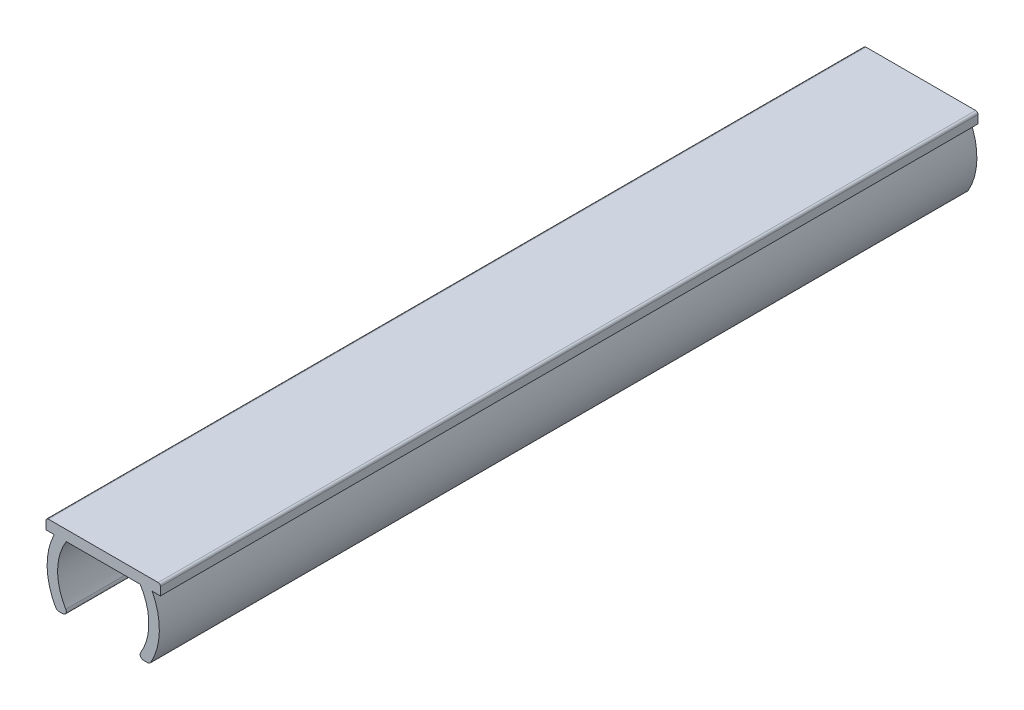
ISO-10303-21;
HEADER;
FILE_DESCRIPTION(('STEP AP214'),'2;1');
FILE_NAME('part.step','',(''),(''),'','','');
FILE_SCHEMA(('AUTOMOTIVE_DESIGN { 1 0 10303 214 1 1 1 1 }'));
ENDSEC;
DATA;
#1=APPLICATION_CONTEXT('core data for automotive mechanical design processes');
#2=APPLICATION_PROTOCOL_DEFINITION('international standard','automotive_design',2000,#1);
#3=PRODUCT_CONTEXT('',#1,'mechanical');
#4=PRODUCT('Part','Part','',(#3));
#5=PRODUCT_RELATED_PRODUCT_CATEGORY('part','',(#4));
#6=PRODUCT_DEFINITION_FORMATION('','',#4);
#7=PRODUCT_DEFINITION_CONTEXT('part definition',#1,'design');
#8=PRODUCT_DEFINITION('design','',#6,#7);
#9=PRODUCT_DEFINITION_SHAPE('','',#8);
#10=(LENGTH_UNIT() NAMED_UNIT(*) SI_UNIT(.MILLI.,.METRE.));
#11=(NAMED_UNIT(*) PLANE_ANGLE_UNIT() SI_UNIT($,.RADIAN.));
#12=(NAMED_UNIT(*) SI_UNIT($,.STERADIAN.) SOLID_ANGLE_UNIT());
#13=UNCERTAINTY_MEASURE_WITH_UNIT(LENGTH_MEASURE(1.E-05),#10,'distance_accuracy_value','');
#14=(GEOMETRIC_REPRESENTATION_CONTEXT(3) GLOBAL_UNCERTAINTY_ASSIGNED_CONTEXT((#13)) GLOBAL_UNIT_ASSIGNED_CONTEXT((#10,
#11,#12)) REPRESENTATION_CONTEXT('',''));
#15=CARTESIAN_POINT('',(0.,0.,0.));
#16=DIRECTION('',(0.,0.,1.));
#17=DIRECTION('',(1.,0.,0.));
#18=AXIS2_PLACEMENT_3D('',#15,#16,#17);
#19=CARTESIAN_POINT('',(0.199999999999989,0.700000000000045,70.));
#20=DIRECTION('',(0.,0.,-1.));
#21=DIRECTION('',(-1.,0.,0.));
#22=AXIS2_PLACEMENT_3D('',#19,#20,#21);
#23=CYLINDRICAL_SURFACE('',#22,0.200000000000023);
#24=CARTESIAN_POINT('',(0.199999999999989,0.700000000000045,0.));
#25=DIRECTION('',(0.,0.,1.));
#26=DIRECTION('',(1.,0.,0.));
#27=AXIS2_PLACEMENT_3D('',#24,#25,#26);
#28=CIRCLE('',#27,0.200000000000023);
#29=CARTESIAN_POINT('',(0.199999999999989,0.900000000000091,0.));
#30=VERTEX_POINT('',#29);
#31=CARTESIAN_POINT('',(0.,0.700000000000045,0.));
#32=VERTEX_POINT('',#31);
#33=EDGE_CURVE('E191',#30,#32,#28,.T.);
#34=ORIENTED_EDGE('',*,*,#33,.T.);
#35=DIRECTION('',(0.,0.,-1.));
#36=VECTOR('',#35,1.);
#37=CARTESIAN_POINT('',(0.,0.700000000000045,70.));
#38=LINE('',#37,#36);
#39=CARTESIAN_POINT('',(0.,0.700000000000045,70.));
#40=VERTEX_POINT('',#39);
#41=EDGE_CURVE('E11',#40,#32,#38,.T.);
#42=ORIENTED_EDGE('',*,*,#41,.F.);
#43=CARTESIAN_POINT('',(0.199999999999989,0.700000000000045,70.));
#44=DIRECTION('',(0.,0.,1.));
#45=DIRECTION('',(1.,0.,0.));
#46=AXIS2_PLACEMENT_3D('',#43,#44,#45);
#47=CIRCLE('',#46,0.200000000000023);
#48=CARTESIAN_POINT('',(0.199999999999989,0.900000000000091,70.));
#49=VERTEX_POINT('',#48);
#50=EDGE_CURVE('E225',#49,#40,#47,.T.);
#51=ORIENTED_EDGE('',*,*,#50,.F.);
#52=DIRECTION('',(0.,0.,-1.));
#53=VECTOR('',#52,1.);
#54=CARTESIAN_POINT('',(0.199999999999989,0.900000000000091,70.));
#55=LINE('',#54,#53);
#56=EDGE_CURVE('E187',#49,#30,#55,.T.);
#57=ORIENTED_EDGE('',*,*,#56,.T.);
#58=EDGE_LOOP('',(#34,#42,#51,#57));
#59=FACE_BOUND('',#58,.T.);
#60=ADVANCED_FACE('F35',(#59),#23,.T.);
#61=CARTESIAN_POINT('',(0.,0.,70.));
#62=DIRECTION('',(1.,0.,0.));
#63=DIRECTION('',(0.,1.,0.));
#64=AXIS2_PLACEMENT_3D('',#61,#62,#63);
#65=PLANE('',#64);
#66=DIRECTION('',(0.,-1.,0.));
#67=VECTOR('',#66,1.);
#68=CARTESIAN_POINT('',(0.,0.,0.));
#69=LINE('',#68,#67);
#70=CARTESIAN_POINT('',(0.,0.,0.));
#71=VERTEX_POINT('',#70);
#72=EDGE_CURVE('E194',#32,#71,#69,.T.);
#73=ORIENTED_EDGE('',*,*,#72,.T.);
#74=DIRECTION('',(0.,0.,-1.));
#75=VECTOR('',#74,1.);
#76=CARTESIAN_POINT('',(0.,0.,70.));
#77=LINE('',#76,#75);
#78=CARTESIAN_POINT('',(0.,0.,70.));
#79=VERTEX_POINT('',#78);
#80=EDGE_CURVE('E43',#79,#71,#77,.T.);
#81=ORIENTED_EDGE('',*,*,#80,.F.);
#82=DIRECTION('',(0.,-1.,0.));
#83=VECTOR('',#82,1.);
#84=CARTESIAN_POINT('',(0.,0.,70.));
#85=LINE('',#84,#83);
#86=EDGE_CURVE('E124',#40,#79,#85,.T.);
#87=ORIENTED_EDGE('',*,*,#86,.F.);
#88=ORIENTED_EDGE('',*,*,#41,.T.);
#89=EDGE_LOOP('',(#73,#81,#87,#88));
#90=FACE_BOUND('',#89,.T.);
#91=ADVANCED_FACE('F333',(#90),#65,.F.);
#92=CARTESIAN_POINT('',(0.,0.,70.));
#93=DIRECTION('',(1.61466166954841E-13,1.,0.));
#94=DIRECTION('',(-1.,1.61466166954841E-13,0.));
#95=AXIS2_PLACEMENT_3D('',#92,#93,#94);
#96=PLANE('',#95);
#97=DIRECTION('',(1.,-1.61466166954841E-13,0.));
#98=VECTOR('',#97,1.);
#99=CARTESIAN_POINT('',(0.,0.,0.));
#100=LINE('',#99,#98);
#101=CARTESIAN_POINT('',(0.704090769389536,-1.06685493772574E-13,0.));
#102=VERTEX_POINT('',#101);
#103=EDGE_CURVE('E196',#71,#102,#100,.T.);
#104=ORIENTED_EDGE('',*,*,#103,.T.);
#105=DIRECTION('',(0.,0.,-1.));
#106=VECTOR('',#105,1.);
#107=CARTESIAN_POINT('',(0.704090769389536,-1.06685493772574E-13,70.));
#108=LINE('',#107,#106);
#109=CARTESIAN_POINT('',(0.704090769389536,-1.06685493772574E-13,70.));
#110=VERTEX_POINT('',#109);
#111=EDGE_CURVE('E262',#110,#102,#108,.T.);
#112=ORIENTED_EDGE('',*,*,#111,.F.);
#113=DIRECTION('',(1.,-1.61466166954841E-13,0.));
#114=VECTOR('',#113,1.);
#115=CARTESIAN_POINT('',(0.,0.,70.));
#116=LINE('',#115,#114);
#117=EDGE_CURVE('E270',#79,#110,#116,.T.);
#118=ORIENTED_EDGE('',*,*,#117,.F.);
#119=ORIENTED_EDGE('',*,*,#80,.T.);
#120=EDGE_LOOP('',(#104,#112,#118,#119));
#121=FACE_BOUND('',#120,.T.);
#122=ADVANCED_FACE('F268',(#121),#96,.F.);
#123=CARTESIAN_POINT('',(5.7569808094936,-2.55424839489524,70.));
#124=DIRECTION('',(0.,0.,-1.));
#125=DIRECTION('',(-1.,0.,0.));
#126=AXIS2_PLACEMENT_3D('',#123,#124,#125);
#127=CYLINDRICAL_SURFACE('',#126,5.66179146738973);
#128=CARTESIAN_POINT('',(5.7569808094936,-2.55424839489524,0.));
#129=DIRECTION('',(0.,0.,1.));
#130=DIRECTION('',(1.,0.,0.));
#131=AXIS2_PLACEMENT_3D('',#128,#129,#130);
#132=CIRCLE('',#131,5.66179146738973);
#133=CARTESIAN_POINT('',(0.832486251485196,-5.34803363509428,0.));
#134=VERTEX_POINT('',#133);
#135=EDGE_CURVE('E198',#102,#134,#132,.T.);
#136=ORIENTED_EDGE('',*,*,#135,.T.);
#137=DIRECTION('',(0.,0.,-1.));
#138=VECTOR('',#137,1.);
#139=CARTESIAN_POINT('',(0.832486251485196,-5.34803363509428,70.));
#140=LINE('',#139,#138);
#141=CARTESIAN_POINT('',(0.832486251485196,-5.34803363509428,70.));
#142=VERTEX_POINT('',#141);
#143=EDGE_CURVE('E259',#142,#134,#140,.T.);
#144=ORIENTED_EDGE('',*,*,#143,.F.);
#145=CARTESIAN_POINT('',(5.7569808094936,-2.55424839489524,70.));
#146=DIRECTION('',(0.,0.,1.));
#147=DIRECTION('',(1.,0.,0.));
#148=AXIS2_PLACEMENT_3D('',#145,#146,#147);
#149=CIRCLE('',#148,5.66179146738973);
#150=EDGE_CURVE('E288',#110,#142,#149,.T.);
#151=ORIENTED_EDGE('',*,*,#150,.F.);
#152=ORIENTED_EDGE('',*,*,#111,.T.);
#153=EDGE_LOOP('',(#136,#144,#151,#152));
#154=FACE_BOUND('',#153,.T.);
#155=ADVANCED_FACE('F279',(#154),#127,.T.);
#156=CARTESIAN_POINT('',(1.09341927523337,-5.19999999999459,70.));
#157=DIRECTION('',(0.,0.,-1.));
#158=DIRECTION('',(-1.,0.,0.));
#159=AXIS2_PLACEMENT_3D('',#156,#157,#158);
#160=CYLINDRICAL_SURFACE('',#159,0.300000000005325);
#161=CARTESIAN_POINT('',(1.09341927523337,-5.19999999999459,0.));
#162=DIRECTION('',(0.,0.,1.));
#163=DIRECTION('',(1.,0.,0.));
#164=AXIS2_PLACEMENT_3D('',#161,#162,#163);
#165=CIRCLE('',#164,0.300000000005325);
#166=CARTESIAN_POINT('',(1.09341927523218,-5.5,0.));
#167=VERTEX_POINT('',#166);
#168=EDGE_CURVE('E200',#134,#167,#165,.T.);
#169=ORIENTED_EDGE('',*,*,#168,.T.);
#170=DIRECTION('',(0.,0.,-1.));
#171=VECTOR('',#170,1.);
#172=CARTESIAN_POINT('',(1.09341927523218,-5.5,70.));
#173=LINE('',#172,#171);
#174=CARTESIAN_POINT('',(1.09341927523218,-5.5,70.));
#175=VERTEX_POINT('',#174);
#176=EDGE_CURVE('E256',#175,#167,#173,.T.);
#177=ORIENTED_EDGE('',*,*,#176,.F.);
#178=CARTESIAN_POINT('',(1.09341927523337,-5.19999999999459,70.));
#179=DIRECTION('',(0.,0.,1.));
#180=DIRECTION('',(1.,0.,0.));
#181=AXIS2_PLACEMENT_3D('',#178,#179,#180);
#182=CIRCLE('',#181,0.300000000005325);
#183=EDGE_CURVE('E285',#142,#175,#182,.T.);
#184=ORIENTED_EDGE('',*,*,#183,.F.);
#185=ORIENTED_EDGE('',*,*,#143,.T.);
#186=EDGE_LOOP('',(#169,#177,#184,#185));
#187=FACE_BOUND('',#186,.T.);
#188=ADVANCED_FACE('F283',(#187),#160,.T.);
#189=CARTESIAN_POINT('',(1.44169040171874,-5.5,70.));
#190=DIRECTION('',(0.,1.,0.));
#191=DIRECTION('',(0.,0.,1.));
#192=AXIS2_PLACEMENT_3D('',#189,#190,#191);
#193=PLANE('',#192);
#194=DIRECTION('',(1.,0.,0.));
#195=VECTOR('',#194,1.);
#196=CARTESIAN_POINT('',(1.44169040171874,-5.5,0.));
#197=LINE('',#196,#195);
#198=CARTESIAN_POINT('',(1.44169040171874,-5.49999999999996,0.));
#199=VERTEX_POINT('',#198);
#200=EDGE_CURVE('E202',#167,#199,#197,.T.);
#201=ORIENTED_EDGE('',*,*,#200,.T.);
#202=DIRECTION('',(0.,0.,-1.));
#203=VECTOR('',#202,1.);
#204=CARTESIAN_POINT('',(1.44169040171874,-5.49999999999996,70.));
#205=LINE('',#204,#203);
#206=CARTESIAN_POINT('',(1.44169040171874,-5.49999999999996,70.));
#207=VERTEX_POINT('',#206);
#208=EDGE_CURVE('E253',#207,#199,#205,.T.);
#209=ORIENTED_EDGE('',*,*,#208,.F.);
#210=DIRECTION('',(1.,0.,0.));
#211=VECTOR('',#210,1.);
#212=CARTESIAN_POINT('',(1.44169040171874,-5.5,70.));
#213=LINE('',#212,#211);
#214=EDGE_CURVE('E287',#175,#207,#213,.T.);
#215=ORIENTED_EDGE('',*,*,#214,.F.);
#216=ORIENTED_EDGE('',*,*,#176,.T.);
#217=EDGE_LOOP('',(#201,#209,#215,#216));
#218=FACE_BOUND('',#217,.T.);
#219=ADVANCED_FACE('F346',(#218),#193,.F.);
#220=CARTESIAN_POINT('',(1.44169040171846,-5.19999999999925,70.));
#221=DIRECTION('',(0.,0.,-1.));
#222=DIRECTION('',(-1.,0.,0.));
#223=AXIS2_PLACEMENT_3D('',#220,#221,#222);
#224=CYLINDRICAL_SURFACE('',#223,0.300000000000715);
#225=CARTESIAN_POINT('',(1.44169040171846,-5.19999999999925,0.));
#226=DIRECTION('',(0.,0.,1.));
#227=DIRECTION('',(1.,0.,0.));
#228=AXIS2_PLACEMENT_3D('',#225,#226,#227);
#229=CIRCLE('',#228,0.300000000000715);
#230=CARTESIAN_POINT('',(1.69744710972944,-5.04319277341894,0.));
#231=VERTEX_POINT('',#230);
#232=EDGE_CURVE('E204',#199,#231,#229,.T.);
#233=ORIENTED_EDGE('',*,*,#232,.T.);
#234=DIRECTION('',(0.,0.,-1.));
#235=VECTOR('',#234,1.);
#236=CARTESIAN_POINT('',(1.69744710972944,-5.04319277341894,70.));
#237=LINE('',#236,#235);
#238=CARTESIAN_POINT('',(1.69744710972944,-5.04319277341894,70.));
#239=VERTEX_POINT('',#238);
#240=EDGE_CURVE('E250',#239,#231,#237,.T.);
#241=ORIENTED_EDGE('',*,*,#240,.F.);
#242=CARTESIAN_POINT('',(1.44169040171846,-5.19999999999925,70.));
#243=DIRECTION('',(0.,0.,1.));
#244=DIRECTION('',(1.,0.,0.));
#245=AXIS2_PLACEMENT_3D('',#242,#243,#244);
#246=CIRCLE('',#245,0.300000000000715);
#247=EDGE_CURVE('E290',#207,#239,#246,.T.);
#248=ORIENTED_EDGE('',*,*,#247,.F.);
#249=ORIENTED_EDGE('',*,*,#208,.T.);
#250=EDGE_LOOP('',(#233,#241,#248,#249));
#251=FACE_BOUND('',#250,.T.);
#252=ADVANCED_FACE('F349',(#251),#224,.T.);
#253=CARTESIAN_POINT('',(5.7569808094936,-2.55424839489524,70.));
#254=DIRECTION('',(0.,0.,-1.));
#255=DIRECTION('',(-1.,0.,0.));
#256=AXIS2_PLACEMENT_3D('',#253,#254,#255);
#257=CYLINDRICAL_SURFACE('',#256,4.76179146738973);
#258=CARTESIAN_POINT('',(5.7569808094936,-2.55424839489524,0.));
#259=DIRECTION('',(0.,0.,-1.));
#260=DIRECTION('',(1.,0.,0.));
#261=AXIS2_PLACEMENT_3D('',#258,#259,#260);
#262=CIRCLE('',#261,4.76179146738973);
#263=CARTESIAN_POINT('',(1.73821568621491,-1.13686837721616E-13,0.));
#264=VERTEX_POINT('',#263);
#265=EDGE_CURVE('E206',#231,#264,#262,.T.);
#266=ORIENTED_EDGE('',*,*,#265,.T.);
#267=DIRECTION('',(0.,0.,-1.));
#268=VECTOR('',#267,1.);
#269=CARTESIAN_POINT('',(1.73821568621491,-1.13686837721616E-13,70.));
#270=LINE('',#269,#268);
#271=CARTESIAN_POINT('',(1.73821568621491,-1.13686837721616E-13,70.));
#272=VERTEX_POINT('',#271);
#273=EDGE_CURVE('E247',#272,#264,#270,.T.);
#274=ORIENTED_EDGE('',*,*,#273,.F.);
#275=CARTESIAN_POINT('',(5.7569808094936,-2.55424839489524,70.));
#276=DIRECTION('',(0.,0.,-1.));
#277=DIRECTION('',(1.,0.,0.));
#278=AXIS2_PLACEMENT_3D('',#275,#276,#277);
#279=CIRCLE('',#278,4.76179146738973);
#280=EDGE_CURVE('E296',#239,#272,#279,.T.);
#281=ORIENTED_EDGE('',*,*,#280,.F.);
#282=ORIENTED_EDGE('',*,*,#240,.T.);
#283=EDGE_LOOP('',(#266,#274,#281,#282));
#284=FACE_BOUND('',#283,.T.);
#285=ADVANCED_FACE('F353',(#284),#257,.F.);
#286=CARTESIAN_POINT('',(1.73821568621491,-1.13686837721616E-13,70.));
#287=DIRECTION('',(0.,1.,0.));
#288=DIRECTION('',(-1.,0.,0.));
#289=AXIS2_PLACEMENT_3D('',#286,#287,#288);
#290=PLANE('',#289);
#291=DIRECTION('',(1.,0.,0.));
#292=VECTOR('',#291,1.);
#293=CARTESIAN_POINT('',(1.73821568621491,-1.13686837721616E-13,0.));
#294=LINE('',#293,#292);
#295=CARTESIAN_POINT('',(8.06178431378503,0.,0.));
#296=VERTEX_POINT('',#295);
#297=EDGE_CURVE('E208',#264,#296,#294,.T.);
#298=ORIENTED_EDGE('',*,*,#297,.T.);
#299=DIRECTION('',(0.,0.,-1.));
#300=VECTOR('',#299,1.);
#301=CARTESIAN_POINT('',(8.06178431378503,0.,70.));
#302=LINE('',#301,#300);
#303=CARTESIAN_POINT('',(8.06178431378503,0.,70.));
#304=VERTEX_POINT('',#303);
#305=EDGE_CURVE('E244',#304,#296,#302,.T.);
#306=ORIENTED_EDGE('',*,*,#305,.F.);
#307=DIRECTION('',(1.,0.,0.));
#308=VECTOR('',#307,1.);
#309=CARTESIAN_POINT('',(1.73821568621491,-1.13686837721616E-13,70.));
#310=LINE('',#309,#308);
#311=EDGE_CURVE('E298',#272,#304,#310,.T.);
#312=ORIENTED_EDGE('',*,*,#311,.F.);
#313=ORIENTED_EDGE('',*,*,#273,.T.);
#314=EDGE_LOOP('',(#298,#306,#312,#313));
#315=FACE_BOUND('',#314,.T.);
#316=ADVANCED_FACE('F357',(#315),#290,.F.);
#317=CARTESIAN_POINT('',(4.04301919050636,-2.55424839489524,70.));
#318=DIRECTION('',(0.,0.,-1.));
#319=DIRECTION('',(-1.,0.,0.));
#320=AXIS2_PLACEMENT_3D('',#317,#318,#319);
#321=CYLINDRICAL_SURFACE('',#320,4.76179146738976);
#322=CARTESIAN_POINT('',(4.04301919050636,-2.55424839489524,0.));
#323=DIRECTION('',(0.,0.,-1.));
#324=DIRECTION('',(1.,0.,0.));
#325=AXIS2_PLACEMENT_3D('',#322,#323,#324);
#326=CIRCLE('',#325,4.76179146738976);
#327=CARTESIAN_POINT('',(8.10255289027043,-5.04319277341906,0.));
#328=VERTEX_POINT('',#327);
#329=EDGE_CURVE('E210',#296,#328,#326,.T.);
#330=ORIENTED_EDGE('',*,*,#329,.T.);
#331=DIRECTION('',(0.,0.,-1.));
#332=VECTOR('',#331,1.);
#333=CARTESIAN_POINT('',(8.10255289027043,-5.04319277341906,70.));
#334=LINE('',#333,#332);
#335=CARTESIAN_POINT('',(8.10255289027043,-5.04319277341906,70.));
#336=VERTEX_POINT('',#335);
#337=EDGE_CURVE('E241',#336,#328,#334,.T.);
#338=ORIENTED_EDGE('',*,*,#337,.F.);
#339=CARTESIAN_POINT('',(4.04301919050636,-2.55424839489524,70.));
#340=DIRECTION('',(0.,0.,-1.));
#341=DIRECTION('',(1.,0.,0.));
#342=AXIS2_PLACEMENT_3D('',#339,#340,#341);
#343=CIRCLE('',#342,4.76179146738976);
#344=EDGE_CURVE('E300',#304,#336,#343,.T.);
#345=ORIENTED_EDGE('',*,*,#344,.F.);
#346=ORIENTED_EDGE('',*,*,#305,.T.);
#347=EDGE_LOOP('',(#330,#338,#345,#346));
#348=FACE_BOUND('',#347,.T.);
#349=ADVANCED_FACE('F361',(#348),#321,.F.);
#350=CARTESIAN_POINT('',(8.35830959828149,-5.19999999999925,70.));
#351=DIRECTION('',(0.,0.,-1.));
#352=DIRECTION('',(-1.,0.,0.));
#353=AXIS2_PLACEMENT_3D('',#350,#351,#352);
#354=CYLINDRICAL_SURFACE('',#353,0.300000000000715);
#355=CARTESIAN_POINT('',(8.35830959828149,-5.19999999999925,0.));
#356=DIRECTION('',(0.,0.,1.));
#357=DIRECTION('',(1.,0.,0.));
#358=AXIS2_PLACEMENT_3D('',#355,#356,#357);
#359=CIRCLE('',#358,0.300000000000715);
#360=CARTESIAN_POINT('',(8.35830959828121,-5.5,0.));
#361=VERTEX_POINT('',#360);
#362=EDGE_CURVE('E212',#328,#361,#359,.T.);
#363=ORIENTED_EDGE('',*,*,#362,.T.);
#364=DIRECTION('',(0.,0.,-1.));
#365=VECTOR('',#364,1.);
#366=CARTESIAN_POINT('',(8.35830959828121,-5.5,70.));
#367=LINE('',#366,#365);
#368=CARTESIAN_POINT('',(8.35830959828121,-5.5,70.));
#369=VERTEX_POINT('',#368);
#370=EDGE_CURVE('E238',#369,#361,#367,.T.);
#371=ORIENTED_EDGE('',*,*,#370,.F.);
#372=CARTESIAN_POINT('',(8.35830959828149,-5.19999999999925,70.));
#373=DIRECTION('',(0.,0.,1.));
#374=DIRECTION('',(1.,0.,0.));
#375=AXIS2_PLACEMENT_3D('',#372,#373,#374);
#376=CIRCLE('',#375,0.300000000000715);
#377=EDGE_CURVE('E302',#336,#369,#376,.T.);
#378=ORIENTED_EDGE('',*,*,#377,.F.);
#379=ORIENTED_EDGE('',*,*,#337,.T.);
#380=EDGE_LOOP('',(#363,#371,#378,#379));
#381=FACE_BOUND('',#380,.T.);
#382=ADVANCED_FACE('F365',(#381),#354,.T.);
#383=CARTESIAN_POINT('',(8.35830959828121,-5.5,70.));
#384=DIRECTION('',(0.,1.,0.));
#385=DIRECTION('',(0.,0.,1.));
#386=AXIS2_PLACEMENT_3D('',#383,#384,#385);
#387=PLANE('',#386);
#388=DIRECTION('',(1.,0.,0.));
#389=VECTOR('',#388,1.);
#390=CARTESIAN_POINT('',(8.35830959828121,-5.5,0.));
#391=LINE('',#390,#389);
#392=CARTESIAN_POINT('',(8.70658072476778,-5.49999999999991,0.));
#393=VERTEX_POINT('',#392);
#394=EDGE_CURVE('E214',#361,#393,#391,.T.);
#395=ORIENTED_EDGE('',*,*,#394,.T.);
#396=DIRECTION('',(0.,0.,-1.));
#397=VECTOR('',#396,1.);
#398=CARTESIAN_POINT('',(8.70658072476778,-5.49999999999991,70.));
#399=LINE('',#398,#397);
#400=CARTESIAN_POINT('',(8.70658072476778,-5.49999999999991,70.));
#401=VERTEX_POINT('',#400);
#402=EDGE_CURVE('E235',#401,#393,#399,.T.);
#403=ORIENTED_EDGE('',*,*,#402,.F.);
#404=DIRECTION('',(1.,0.,0.));
#405=VECTOR('',#404,1.);
#406=CARTESIAN_POINT('',(8.35830959828121,-5.5,70.));
#407=LINE('',#406,#405);
#408=EDGE_CURVE('E304',#369,#401,#407,.T.);
#409=ORIENTED_EDGE('',*,*,#408,.F.);
#410=ORIENTED_EDGE('',*,*,#370,.T.);
#411=EDGE_LOOP('',(#395,#403,#409,#410));
#412=FACE_BOUND('',#411,.T.);
#413=ADVANCED_FACE('F369',(#412),#387,.F.);
#414=CARTESIAN_POINT('',(8.70658072476658,-5.19999999999459,70.));
#415=DIRECTION('',(0.,0.,-1.));
#416=DIRECTION('',(-1.,0.,0.));
#417=AXIS2_PLACEMENT_3D('',#414,#415,#416);
#418=CYLINDRICAL_SURFACE('',#417,0.300000000005325);
#419=CARTESIAN_POINT('',(8.70658072476658,-5.19999999999459,0.));
#420=DIRECTION('',(0.,0.,1.));
#421=DIRECTION('',(1.,0.,0.));
#422=AXIS2_PLACEMENT_3D('',#419,#420,#421);
#423=CIRCLE('',#422,0.300000000005325);
#424=CARTESIAN_POINT('',(8.96751374851469,-5.34803363509424,0.));
#425=VERTEX_POINT('',#424);
#426=EDGE_CURVE('E216',#393,#425,#423,.T.);
#427=ORIENTED_EDGE('',*,*,#426,.T.);
#428=DIRECTION('',(0.,0.,-1.));
#429=VECTOR('',#428,1.);
#430=CARTESIAN_POINT('',(8.96751374851469,-5.34803363509424,70.));
#431=LINE('',#430,#429);
#432=CARTESIAN_POINT('',(8.96751374851469,-5.34803363509424,70.));
#433=VERTEX_POINT('',#432);
#434=EDGE_CURVE('E232',#433,#425,#431,.T.);
#435=ORIENTED_EDGE('',*,*,#434,.F.);
#436=CARTESIAN_POINT('',(8.70658072476658,-5.19999999999459,70.));
#437=DIRECTION('',(0.,0.,1.));
#438=DIRECTION('',(1.,0.,0.));
#439=AXIS2_PLACEMENT_3D('',#436,#437,#438);
#440=CIRCLE('',#439,0.300000000005325);
#441=EDGE_CURVE('E306',#401,#433,#440,.T.);
#442=ORIENTED_EDGE('',*,*,#441,.F.);
#443=ORIENTED_EDGE('',*,*,#402,.T.);
#444=EDGE_LOOP('',(#427,#435,#442,#443));
#445=FACE_BOUND('',#444,.T.);
#446=ADVANCED_FACE('F373',(#445),#418,.T.);
#447=CARTESIAN_POINT('',(4.04301919050636,-2.55424839489524,70.));
#448=DIRECTION('',(0.,0.,-1.));
#449=DIRECTION('',(-1.,0.,0.));
#450=AXIS2_PLACEMENT_3D('',#447,#448,#449);
#451=CYLINDRICAL_SURFACE('',#450,5.66179146738976);
#452=CARTESIAN_POINT('',(4.04301919050636,-2.55424839489524,0.));
#453=DIRECTION('',(0.,0.,1.));
#454=DIRECTION('',(1.,0.,0.));
#455=AXIS2_PLACEMENT_3D('',#452,#453,#454);
#456=CIRCLE('',#455,5.66179146738976);
#457=CARTESIAN_POINT('',(9.0959092306104,0.,0.));
#458=VERTEX_POINT('',#457);
#459=EDGE_CURVE('E218',#425,#458,#456,.T.);
#460=ORIENTED_EDGE('',*,*,#459,.T.);
#461=DIRECTION('',(0.,0.,-1.));
#462=VECTOR('',#461,1.);
#463=CARTESIAN_POINT('',(9.0959092306104,0.,70.));
#464=LINE('',#463,#462);
#465=CARTESIAN_POINT('',(9.0959092306104,0.,70.));
#466=VERTEX_POINT('',#465);
#467=EDGE_CURVE('E229',#466,#458,#464,.T.);
#468=ORIENTED_EDGE('',*,*,#467,.F.);
#469=CARTESIAN_POINT('',(4.04301919050636,-2.55424839489524,70.));
#470=DIRECTION('',(0.,0.,1.));
#471=DIRECTION('',(1.,0.,0.));
#472=AXIS2_PLACEMENT_3D('',#469,#470,#471);
#473=CIRCLE('',#472,5.66179146738976);
#474=EDGE_CURVE('E308',#433,#466,#473,.T.);
#475=ORIENTED_EDGE('',*,*,#474,.F.);
#476=ORIENTED_EDGE('',*,*,#434,.T.);
#477=EDGE_LOOP('',(#460,#468,#475,#476));
#478=FACE_BOUND('',#477,.T.);
#479=ADVANCED_FACE('F314',(#478),#451,.T.);
#480=CARTESIAN_POINT('',(9.0959092306104,0.,70.));
#481=DIRECTION('',(0.,1.,0.));
#482=DIRECTION('',(0.,0.,1.));
#483=AXIS2_PLACEMENT_3D('',#480,#481,#482);
#484=PLANE('',#483);
#485=DIRECTION('',(1.,0.,0.));
#486=VECTOR('',#485,1.);
#487=CARTESIAN_POINT('',(9.0959092306104,0.,0.));
#488=LINE('',#487,#486);
#489=CARTESIAN_POINT('',(9.79999999999995,0.,0.));
#490=VERTEX_POINT('',#489);
#491=EDGE_CURVE('E220',#458,#490,#488,.T.);
#492=ORIENTED_EDGE('',*,*,#491,.T.);
#493=DIRECTION('',(0.,0.,-1.));
#494=VECTOR('',#493,1.);
#495=CARTESIAN_POINT('',(9.79999999999995,0.,70.));
#496=LINE('',#495,#494);
#497=CARTESIAN_POINT('',(9.79999999999995,0.,70.));
#498=VERTEX_POINT('',#497);
#499=EDGE_CURVE('E182',#498,#490,#496,.T.);
#500=ORIENTED_EDGE('',*,*,#499,.F.);
#501=DIRECTION('',(1.,0.,0.));
#502=VECTOR('',#501,1.);
#503=CARTESIAN_POINT('',(9.0959092306104,0.,70.));
#504=LINE('',#503,#502);
#505=EDGE_CURVE('E173',#466,#498,#504,.T.);
#506=ORIENTED_EDGE('',*,*,#505,.F.);
#507=ORIENTED_EDGE('',*,*,#467,.T.);
#508=EDGE_LOOP('',(#492,#500,#506,#507));
#509=FACE_BOUND('',#508,.T.);
#510=ADVANCED_FACE('F318',(#509),#484,.F.);
#511=CARTESIAN_POINT('',(9.7999999999999,0.699999999999932,70.));
#512=DIRECTION('',(-1.,0.,0.));
#513=DIRECTION('',(0.,-1.,0.));
#514=AXIS2_PLACEMENT_3D('',#511,#512,#513);
#515=PLANE('',#514);
#516=DIRECTION('',(0.,1.,0.));
#517=VECTOR('',#516,1.);
#518=CARTESIAN_POINT('',(9.7999999999999,0.699999999999932,0.));
#519=LINE('',#518,#517);
#520=CARTESIAN_POINT('',(9.79999999999992,0.699999999999932,0.));
#521=VERTEX_POINT('',#520);
#522=EDGE_CURVE('E181',#490,#521,#519,.T.);
#523=ORIENTED_EDGE('',*,*,#522,.T.);
#524=DIRECTION('',(0.,0.,-1.));
#525=VECTOR('',#524,1.);
#526=CARTESIAN_POINT('',(9.79999999999992,0.699999999999932,70.));
#527=LINE('',#526,#525);
#528=CARTESIAN_POINT('',(9.79999999999992,0.699999999999932,70.));
#529=VERTEX_POINT('',#528);
#530=EDGE_CURVE('E178',#529,#521,#527,.T.);
#531=ORIENTED_EDGE('',*,*,#530,.F.);
#532=DIRECTION('',(0.,1.,0.));
#533=VECTOR('',#532,1.);
#534=CARTESIAN_POINT('',(9.7999999999999,0.699999999999932,70.));
#535=LINE('',#534,#533);
#536=EDGE_CURVE('E167',#498,#529,#535,.T.);
#537=ORIENTED_EDGE('',*,*,#536,.F.);
#538=ORIENTED_EDGE('',*,*,#499,.T.);
#539=EDGE_LOOP('',(#523,#531,#537,#538));
#540=FACE_BOUND('',#539,.T.);
#541=ADVANCED_FACE('F179',(#540),#515,.F.);
#542=CARTESIAN_POINT('',(9.59999999999991,0.699999999999932,70.));
#543=DIRECTION('',(0.,0.,-1.));
#544=DIRECTION('',(-1.,0.,0.));
#545=AXIS2_PLACEMENT_3D('',#542,#543,#544);
#546=CYLINDRICAL_SURFACE('',#545,0.200000000000017);
#547=CARTESIAN_POINT('',(9.59999999999991,0.699999999999932,0.));
#548=DIRECTION('',(0.,0.,1.));
#549=DIRECTION('',(1.,0.,0.));
#550=AXIS2_PLACEMENT_3D('',#547,#548,#549);
#551=CIRCLE('',#550,0.200000000000017);
#552=CARTESIAN_POINT('',(9.59999999999991,0.899999999999977,0.));
#553=VERTEX_POINT('',#552);
#554=EDGE_CURVE('E110',#521,#553,#551,.T.);
#555=ORIENTED_EDGE('',*,*,#554,.T.);
#556=DIRECTION('',(0.,0.,-1.));
#557=VECTOR('',#556,1.);
#558=CARTESIAN_POINT('',(9.59999999999991,0.899999999999977,70.));
#559=LINE('',#558,#557);
#560=CARTESIAN_POINT('',(9.59999999999991,0.899999999999977,70.));
#561=VERTEX_POINT('',#560);
#562=EDGE_CURVE('E183',#561,#553,#559,.T.);
#563=ORIENTED_EDGE('',*,*,#562,.F.);
#564=CARTESIAN_POINT('',(9.59999999999991,0.699999999999932,70.));
#565=DIRECTION('',(0.,0.,1.));
#566=DIRECTION('',(1.,0.,0.));
#567=AXIS2_PLACEMENT_3D('',#564,#565,#566);
#568=CIRCLE('',#567,0.200000000000017);
#569=EDGE_CURVE('E171',#529,#561,#568,.T.);
#570=ORIENTED_EDGE('',*,*,#569,.F.);
#571=ORIENTED_EDGE('',*,*,#530,.T.);
#572=EDGE_LOOP('',(#555,#563,#570,#571));
#573=FACE_BOUND('',#572,.T.);
#574=ADVANCED_FACE('F185',(#573),#546,.T.);
#575=CARTESIAN_POINT('',(0.199999999999989,0.900000000000091,70.));
#576=DIRECTION('',(0.,-1.,0.));
#577=DIRECTION('',(1.,0.,0.));
#578=AXIS2_PLACEMENT_3D('',#575,#576,#577);
#579=PLANE('',#578);
#580=DIRECTION('',(-1.,0.,0.));
#581=VECTOR('',#580,1.);
#582=CARTESIAN_POINT('',(0.199999999999989,0.900000000000091,0.));
#583=LINE('',#582,#581);
#584=EDGE_CURVE('E116',#553,#30,#583,.T.);
#585=ORIENTED_EDGE('',*,*,#584,.T.);
#586=ORIENTED_EDGE('',*,*,#56,.F.);
#587=DIRECTION('',(-1.,0.,0.));
#588=VECTOR('',#587,1.);
#589=CARTESIAN_POINT('',(0.199999999999989,0.900000000000091,70.));
#590=LINE('',#589,#588);
#591=EDGE_CURVE('E51',#561,#49,#590,.T.);
#592=ORIENTED_EDGE('',*,*,#591,.F.);
#593=ORIENTED_EDGE('',*,*,#562,.T.);
#594=EDGE_LOOP('',(#585,#586,#592,#593));
#595=FACE_BOUND('',#594,.T.);
#596=ADVANCED_FACE('F322',(#595),#579,.F.);
#597=CARTESIAN_POINT('',(0.199999999999989,0.700000000000045,70.));
#598=DIRECTION('',(0.,0.,1.));
#599=DIRECTION('',(1.,0.,0.));
#600=AXIS2_PLACEMENT_3D('',#597,#598,#599);
#601=PLANE('',#600);
#602=ORIENTED_EDGE('',*,*,#50,.T.);
#603=ORIENTED_EDGE('',*,*,#86,.T.);
#604=ORIENTED_EDGE('',*,*,#117,.T.);
#605=ORIENTED_EDGE('',*,*,#150,.T.);
#606=ORIENTED_EDGE('',*,*,#183,.T.);
#607=ORIENTED_EDGE('',*,*,#214,.T.);
#608=ORIENTED_EDGE('',*,*,#247,.T.);
#609=ORIENTED_EDGE('',*,*,#280,.T.);
#610=ORIENTED_EDGE('',*,*,#311,.T.);
#611=ORIENTED_EDGE('',*,*,#344,.T.);
#612=ORIENTED_EDGE('',*,*,#377,.T.);
#613=ORIENTED_EDGE('',*,*,#408,.T.);
#614=ORIENTED_EDGE('',*,*,#441,.T.);
#615=ORIENTED_EDGE('',*,*,#474,.T.);
#616=ORIENTED_EDGE('',*,*,#505,.T.);
#617=ORIENTED_EDGE('',*,*,#536,.T.);
#618=ORIENTED_EDGE('',*,*,#569,.T.);
#619=ORIENTED_EDGE('',*,*,#591,.T.);
#620=EDGE_LOOP('',(#602,#603,#604,#605,#606,#607,#608,#609,#610,#611,#612,#613,#614,#615,#616,
#617,#618,#619));
#621=FACE_BOUND('',#620,.T.);
#622=ADVANCED_FACE('F169',(#621),#601,.T.);
#623=CARTESIAN_POINT('',(0.199999999999989,0.700000000000045,0.));
#624=DIRECTION('',(0.,0.,1.));
#625=DIRECTION('',(1.,0.,0.));
#626=AXIS2_PLACEMENT_3D('',#623,#624,#625);
#627=PLANE('',#626);
#628=ORIENTED_EDGE('',*,*,#33,.F.);
#629=ORIENTED_EDGE('',*,*,#584,.F.);
#630=ORIENTED_EDGE('',*,*,#554,.F.);
#631=ORIENTED_EDGE('',*,*,#522,.F.);
#632=ORIENTED_EDGE('',*,*,#491,.F.);
#633=ORIENTED_EDGE('',*,*,#459,.F.);
#634=ORIENTED_EDGE('',*,*,#426,.F.);
#635=ORIENTED_EDGE('',*,*,#394,.F.);
#636=ORIENTED_EDGE('',*,*,#362,.F.);
#637=ORIENTED_EDGE('',*,*,#329,.F.);
#638=ORIENTED_EDGE('',*,*,#297,.F.);
#639=ORIENTED_EDGE('',*,*,#265,.F.);
#640=ORIENTED_EDGE('',*,*,#232,.F.);
#641=ORIENTED_EDGE('',*,*,#200,.F.);
#642=ORIENTED_EDGE('',*,*,#168,.F.);
#643=ORIENTED_EDGE('',*,*,#135,.F.);
#644=ORIENTED_EDGE('',*,*,#103,.F.);
#645=ORIENTED_EDGE('',*,*,#72,.F.);
#646=EDGE_LOOP('',(#628,#629,#630,#631,#632,#633,#634,#635,#636,#637,#638,#639,#640,#641,#642,
#643,#644,#645));
#647=FACE_BOUND('',#646,.T.);
#648=ADVANCED_FACE('F274',(#647),#627,.F.);
#649=CLOSED_SHELL('',(#60,#91,#122,#155,#188,#219,#252,#285,#316,#349,#382,#413,#446,#479,#510,
#541,#574,#596,#622,#648));
#650=MANIFOLD_SOLID_BREP('B2',#649);
#651=ADVANCED_BREP_SHAPE_REPRESENTATION('',(#18,#650),#14);
#652=SHAPE_DEFINITION_REPRESENTATION(#9,#651);
ENDSEC;
END-ISO-10303-21;
